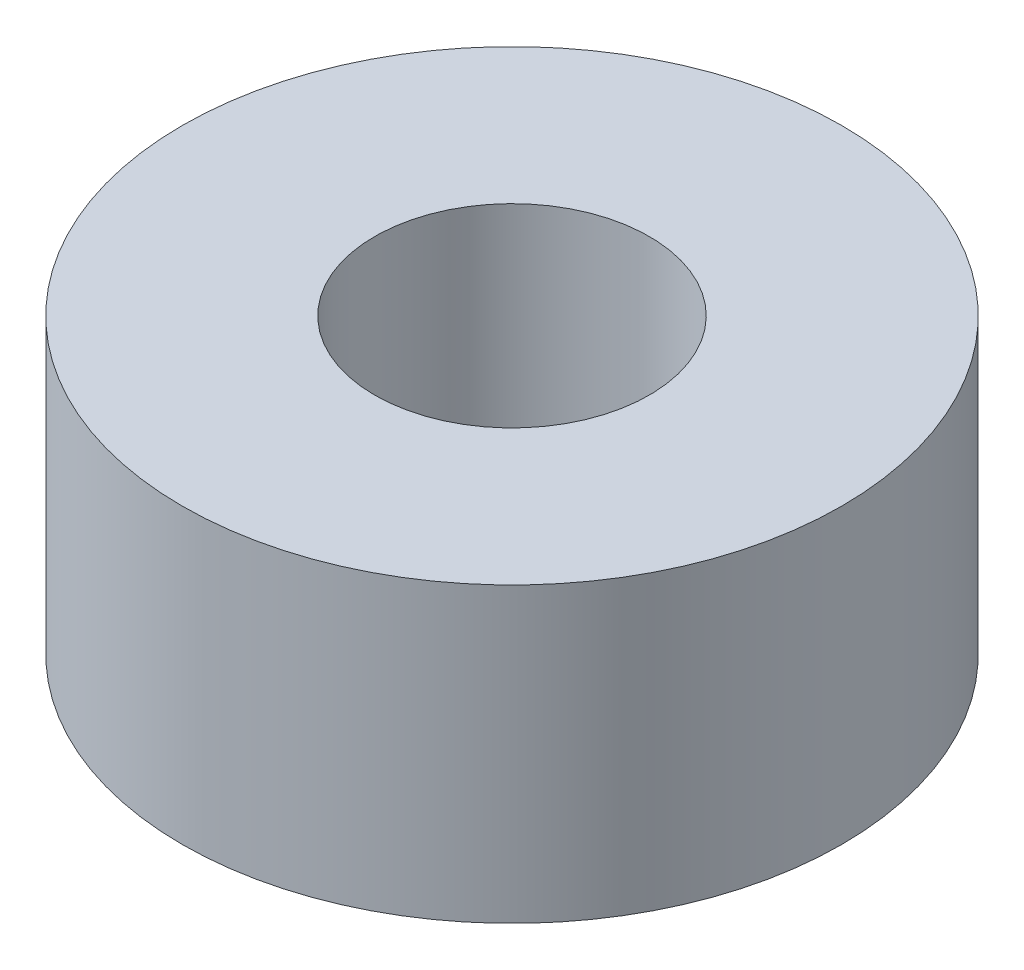
ISO-10303-21;
HEADER;
FILE_DESCRIPTION(('STEP AP214'),'2;1');
FILE_NAME('part.step','',(''),(''),'','','');
FILE_SCHEMA(('AUTOMOTIVE_DESIGN { 1 0 10303 214 1 1 1 1 }'));
ENDSEC;
DATA;
#1=APPLICATION_CONTEXT('core data for automotive mechanical design processes');
#2=APPLICATION_PROTOCOL_DEFINITION('international standard','automotive_design',2000,#1);
#3=PRODUCT_CONTEXT('',#1,'mechanical');
#4=PRODUCT('Part','Part','',(#3));
#5=PRODUCT_RELATED_PRODUCT_CATEGORY('part','',(#4));
#6=PRODUCT_DEFINITION_FORMATION('','',#4);
#7=PRODUCT_DEFINITION_CONTEXT('part definition',#1,'design');
#8=PRODUCT_DEFINITION('design','',#6,#7);
#9=PRODUCT_DEFINITION_SHAPE('','',#8);
#10=(LENGTH_UNIT() NAMED_UNIT(*) SI_UNIT(.MILLI.,.METRE.));
#11=(NAMED_UNIT(*) PLANE_ANGLE_UNIT() SI_UNIT($,.RADIAN.));
#12=(NAMED_UNIT(*) SI_UNIT($,.STERADIAN.) SOLID_ANGLE_UNIT());
#13=UNCERTAINTY_MEASURE_WITH_UNIT(LENGTH_MEASURE(1.E-05),#10,'distance_accuracy_value','');
#14=(GEOMETRIC_REPRESENTATION_CONTEXT(3) GLOBAL_UNCERTAINTY_ASSIGNED_CONTEXT((#13)) GLOBAL_UNIT_ASSIGNED_CONTEXT((#10,
#11,#12)) REPRESENTATION_CONTEXT('',''));
#15=CARTESIAN_POINT('',(0.,0.,0.));
#16=DIRECTION('',(0.,0.,1.));
#17=DIRECTION('',(1.,0.,0.));
#18=AXIS2_PLACEMENT_3D('',#15,#16,#17);
#19=CARTESIAN_POINT('',(0.,16.,0.));
#20=DIRECTION('',(0.,1.,0.));
#21=DIRECTION('',(0.,0.,1.));
#22=AXIS2_PLACEMENT_3D('',#19,#20,#21);
#23=PLANE('',#22);
#24=CARTESIAN_POINT('',(0.,16.,0.));
#25=DIRECTION('',(0.,1.,0.));
#26=DIRECTION('',(0.,0.,1.));
#27=AXIS2_PLACEMENT_3D('',#24,#25,#26);
#28=CIRCLE('',#27,18.);
#29=CARTESIAN_POINT('',(0.,16.,18.));
#30=VERTEX_POINT('',#29);
#31=EDGE_CURVE('E10',#30,#30,#28,.T.);
#32=ORIENTED_EDGE('',*,*,#31,.T.);
#33=EDGE_LOOP('',(#32));
#34=FACE_BOUND('',#33,.T.);
#35=CARTESIAN_POINT('',(0.,16.,0.));
#36=DIRECTION('',(0.,1.,0.));
#37=DIRECTION('',(0.,0.,1.));
#38=AXIS2_PLACEMENT_3D('',#35,#36,#37);
#39=CIRCLE('',#38,7.5);
#40=CARTESIAN_POINT('',(0.,16.,7.5));
#41=VERTEX_POINT('',#40);
#42=EDGE_CURVE('E57',#41,#41,#39,.T.);
#43=ORIENTED_EDGE('',*,*,#42,.F.);
#44=EDGE_LOOP('',(#43));
#45=FACE_BOUND('',#44,.T.);
#46=ADVANCED_FACE('F43',(#34,#45),#23,.T.);
#47=CARTESIAN_POINT('',(0.,0.,0.));
#48=DIRECTION('',(0.,1.,0.));
#49=DIRECTION('',(0.,0.,1.));
#50=AXIS2_PLACEMENT_3D('',#47,#48,#49);
#51=PLANE('',#50);
#52=CARTESIAN_POINT('',(0.,0.,0.));
#53=DIRECTION('',(0.,1.,0.));
#54=DIRECTION('',(0.,0.,1.));
#55=AXIS2_PLACEMENT_3D('',#52,#53,#54);
#56=CIRCLE('',#55,18.);
#57=CARTESIAN_POINT('',(0.,0.,18.));
#58=VERTEX_POINT('',#57);
#59=EDGE_CURVE('E50',#58,#58,#56,.T.);
#60=ORIENTED_EDGE('',*,*,#59,.F.);
#61=EDGE_LOOP('',(#60));
#62=FACE_BOUND('',#61,.T.);
#63=CARTESIAN_POINT('',(0.,0.,0.));
#64=DIRECTION('',(0.,1.,0.));
#65=DIRECTION('',(0.,0.,1.));
#66=AXIS2_PLACEMENT_3D('',#63,#64,#65);
#67=CIRCLE('',#66,7.5);
#68=CARTESIAN_POINT('',(0.,0.,7.5));
#69=VERTEX_POINT('',#68);
#70=EDGE_CURVE('E59',#69,#69,#67,.T.);
#71=ORIENTED_EDGE('',*,*,#70,.T.);
#72=EDGE_LOOP('',(#71));
#73=FACE_BOUND('',#72,.T.);
#74=ADVANCED_FACE('F67',(#62,#73),#51,.F.);
#75=CARTESIAN_POINT('',(0.,16.,0.));
#76=DIRECTION('',(0.,-1.,0.));
#77=DIRECTION('',(0.,0.,-1.));
#78=AXIS2_PLACEMENT_3D('',#75,#76,#77);
#79=CYLINDRICAL_SURFACE('',#78,18.);
#80=ORIENTED_EDGE('',*,*,#31,.F.);
#81=EDGE_LOOP('',(#80));
#82=FACE_BOUND('',#81,.T.);
#83=ORIENTED_EDGE('',*,*,#59,.T.);
#84=EDGE_LOOP('',(#83));
#85=FACE_BOUND('',#84,.T.);
#86=ADVANCED_FACE('F44',(#82,#85),#79,.T.);
#87=CARTESIAN_POINT('',(0.,16.,0.));
#88=DIRECTION('',(0.,-1.,0.));
#89=DIRECTION('',(0.,0.,-1.));
#90=AXIS2_PLACEMENT_3D('',#87,#88,#89);
#91=CYLINDRICAL_SURFACE('',#90,7.5);
#92=ORIENTED_EDGE('',*,*,#42,.T.);
#93=EDGE_LOOP('',(#92));
#94=FACE_BOUND('',#93,.T.);
#95=ORIENTED_EDGE('',*,*,#70,.F.);
#96=EDGE_LOOP('',(#95));
#97=FACE_BOUND('',#96,.T.);
#98=ADVANCED_FACE('F68',(#94,#97),#91,.F.);
#99=CLOSED_SHELL('',(#46,#74,#86,#98));
#100=MANIFOLD_SOLID_BREP('B2',#99);
#101=ADVANCED_BREP_SHAPE_REPRESENTATION('',(#18,#100),#14);
#102=SHAPE_DEFINITION_REPRESENTATION(#9,#101);
ENDSEC;
END-ISO-10303-21;
